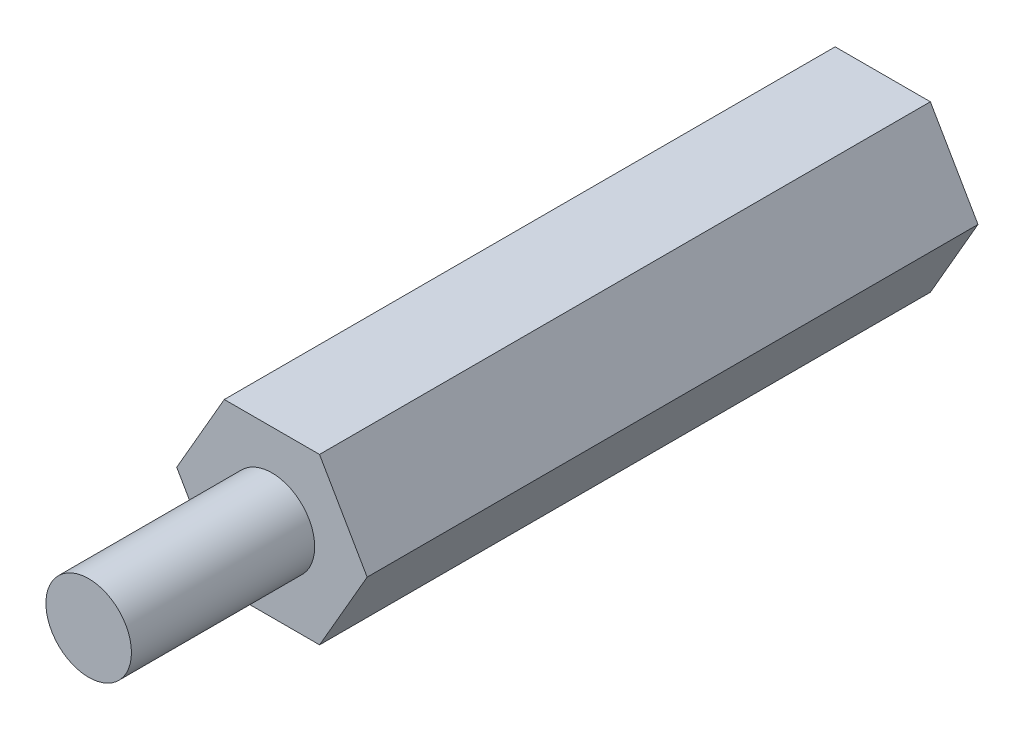
ISO-10303-21;
HEADER;
FILE_DESCRIPTION(('STEP AP214'),'2;1');
FILE_NAME('part.step','',(''),(''),'','','');
FILE_SCHEMA(('AUTOMOTIVE_DESIGN { 1 0 10303 214 1 1 1 1 }'));
ENDSEC;
DATA;
#1=APPLICATION_CONTEXT('core data for automotive mechanical design processes');
#2=APPLICATION_PROTOCOL_DEFINITION('international standard','automotive_design',2000,#1);
#3=PRODUCT_CONTEXT('',#1,'mechanical');
#4=PRODUCT('Part','Part','',(#3));
#5=PRODUCT_RELATED_PRODUCT_CATEGORY('part','',(#4));
#6=PRODUCT_DEFINITION_FORMATION('','',#4);
#7=PRODUCT_DEFINITION_CONTEXT('part definition',#1,'design');
#8=PRODUCT_DEFINITION('design','',#6,#7);
#9=PRODUCT_DEFINITION_SHAPE('','',#8);
#10=(LENGTH_UNIT() NAMED_UNIT(*) SI_UNIT(.MILLI.,.METRE.));
#11=(NAMED_UNIT(*) PLANE_ANGLE_UNIT() SI_UNIT($,.RADIAN.));
#12=(NAMED_UNIT(*) SI_UNIT($,.STERADIAN.) SOLID_ANGLE_UNIT());
#13=UNCERTAINTY_MEASURE_WITH_UNIT(LENGTH_MEASURE(1.E-05),#10,'distance_accuracy_value','');
#14=(GEOMETRIC_REPRESENTATION_CONTEXT(3) GLOBAL_UNCERTAINTY_ASSIGNED_CONTEXT((#13)) GLOBAL_UNIT_ASSIGNED_CONTEXT((#10,
#11,#12)) REPRESENTATION_CONTEXT('',''));
#15=CARTESIAN_POINT('',(0.,0.,0.));
#16=DIRECTION('',(0.,0.,1.));
#17=DIRECTION('',(1.,0.,0.));
#18=AXIS2_PLACEMENT_3D('',#15,#16,#17);
#19=CARTESIAN_POINT('',(0.,0.,26.));
#20=DIRECTION('',(0.,0.,-1.));
#21=DIRECTION('',(-1.,0.,0.));
#22=AXIS2_PLACEMENT_3D('',#19,#20,#21);
#23=CYLINDRICAL_SURFACE('',#22,1.4);
#24=CARTESIAN_POINT('',(0.,0.,26.));
#25=DIRECTION('',(0.,0.,1.));
#26=DIRECTION('',(1.,0.,0.));
#27=AXIS2_PLACEMENT_3D('',#24,#25,#26);
#28=CIRCLE('',#27,1.4);
#29=CARTESIAN_POINT('',(1.4,0.,26.));
#30=VERTEX_POINT('',#29);
#31=EDGE_CURVE('E11',#30,#30,#28,.T.);
#32=ORIENTED_EDGE('',*,*,#31,.F.);
#33=EDGE_LOOP('',(#32));
#34=FACE_BOUND('',#33,.T.);
#35=CARTESIAN_POINT('',(0.,0.,20.));
#36=DIRECTION('',(0.,0.,1.));
#37=DIRECTION('',(1.,0.,0.));
#38=AXIS2_PLACEMENT_3D('',#35,#36,#37);
#39=CIRCLE('',#38,1.4);
#40=CARTESIAN_POINT('',(1.4,0.,20.));
#41=VERTEX_POINT('',#40);
#42=EDGE_CURVE('E45',#41,#41,#39,.T.);
#43=ORIENTED_EDGE('',*,*,#42,.T.);
#44=EDGE_LOOP('',(#43));
#45=FACE_BOUND('',#44,.T.);
#46=ADVANCED_FACE('F42',(#34,#45),#23,.T.);
#47=CARTESIAN_POINT('',(0.,0.,26.));
#48=DIRECTION('',(0.,0.,1.));
#49=DIRECTION('',(1.,0.,0.));
#50=AXIS2_PLACEMENT_3D('',#47,#48,#49);
#51=PLANE('',#50);
#52=ORIENTED_EDGE('',*,*,#31,.T.);
#53=EDGE_LOOP('',(#52));
#54=FACE_BOUND('',#53,.T.);
#55=ADVANCED_FACE('F57',(#54),#51,.T.);
#56=CARTESIAN_POINT('',(0.,0.,20.));
#57=DIRECTION('',(0.,0.,1.));
#58=DIRECTION('',(1.,0.,0.));
#59=AXIS2_PLACEMENT_3D('',#56,#57,#58);
#60=PLANE('',#59);
#61=ORIENTED_EDGE('',*,*,#42,.F.);
#62=EDGE_LOOP('',(#61));
#63=FACE_BOUND('',#62,.T.);
#64=ADVANCED_FACE('F55',(#63),#60,.F.);
#65=CLOSED_SHELL('',(#46,#55,#64));
#66=MANIFOLD_SOLID_BREP('B2',#65);
#67=CARTESIAN_POINT('',(0.,0.,20.));
#68=DIRECTION('',(0.,0.,1.));
#69=DIRECTION('',(1.,0.,0.));
#70=AXIS2_PLACEMENT_3D('',#67,#68,#69);
#71=PLANE('',#70);
#72=DIRECTION('',(-0.999999948616769,-0.000320572081417739,0.));
#73=VECTOR('',#72,1.);
#74=CARTESIAN_POINT('',(1.55798010209363,2.70049958368453,20.));
#75=LINE('',#74,#73);
#76=CARTESIAN_POINT('',(1.55798010209363,2.70049958368453,20.));
#77=VERTEX_POINT('',#76);
#78=CARTESIAN_POINT('',(-1.55971119133329,2.69950013884602,20.));
#79=VERTEX_POINT('',#78);
#80=EDGE_CURVE('E178',#77,#79,#75,.T.);
#81=ORIENTED_EDGE('',*,*,#80,.T.);
#82=DIRECTION('',(-0.499722350742132,-0.866185645325964,0.));
#83=VECTOR('',#82,1.);
#84=CARTESIAN_POINT('',(-1.55971119133329,2.69950013884602,20.));
#85=LINE('',#84,#83);
#86=CARTESIAN_POINT('',(-3.11769129342692,-0.000999444838507815,20.));
#87=VERTEX_POINT('',#86);
#88=EDGE_CURVE('E136',#79,#87,#85,.T.);
#89=ORIENTED_EDGE('',*,*,#88,.T.);
#90=DIRECTION('',(0.500277597874637,-0.865865073244546,0.));
#91=VECTOR('',#90,1.);
#92=CARTESIAN_POINT('',(-3.11769129342692,-0.000999444838507815,20.));
#93=LINE('',#92,#91);
#94=CARTESIAN_POINT('',(-1.55798010209363,-2.70049958368453,20.));
#95=VERTEX_POINT('',#94);
#96=EDGE_CURVE('E149',#87,#95,#93,.T.);
#97=ORIENTED_EDGE('',*,*,#96,.T.);
#98=DIRECTION('',(0.999999948616769,0.000320572081418156,0.));
#99=VECTOR('',#98,1.);
#100=CARTESIAN_POINT('',(-1.55798010209363,-2.70049958368453,20.));
#101=LINE('',#100,#99);
#102=CARTESIAN_POINT('',(1.55971119133329,-2.69950013884602,20.));
#103=VERTEX_POINT('',#102);
#104=EDGE_CURVE('E143',#95,#103,#101,.T.);
#105=ORIENTED_EDGE('',*,*,#104,.T.);
#106=DIRECTION('',(0.499722350742132,0.866185645325964,0.));
#107=VECTOR('',#106,1.);
#108=CARTESIAN_POINT('',(1.55971119133329,-2.69950013884602,20.));
#109=LINE('',#108,#107);
#110=CARTESIAN_POINT('',(3.11769129342692,0.000999444838507037,20.));
#111=VERTEX_POINT('',#110);
#112=EDGE_CURVE('E147',#103,#111,#109,.T.);
#113=ORIENTED_EDGE('',*,*,#112,.T.);
#114=DIRECTION('',(-0.500277597874636,0.865865073244546,0.));
#115=VECTOR('',#114,1.);
#116=CARTESIAN_POINT('',(3.11769129342692,0.000999444838507037,20.));
#117=LINE('',#116,#115);
#118=EDGE_CURVE('E99',#111,#77,#117,.T.);
#119=ORIENTED_EDGE('',*,*,#118,.T.);
#120=EDGE_LOOP('',(#81,#89,#97,#105,#113,#119));
#121=FACE_BOUND('',#120,.T.);
#122=CARTESIAN_POINT('',(0.,0.,20.));
#123=DIRECTION('',(0.,0.,1.));
#124=DIRECTION('',(1.,0.,0.));
#125=AXIS2_PLACEMENT_3D('',#122,#123,#124);
#126=CIRCLE('',#125,1.4);
#127=CARTESIAN_POINT('',(1.4,0.,20.));
#128=VERTEX_POINT('',#127);
#129=EDGE_CURVE('E171',#128,#128,#126,.T.);
#130=ORIENTED_EDGE('',*,*,#129,.F.);
#131=EDGE_LOOP('',(#130));
#132=FACE_BOUND('',#131,.T.);
#133=ADVANCED_FACE('F82',(#121,#132),#71,.T.);
#134=CARTESIAN_POINT('',(0.,0.,0.));
#135=DIRECTION('',(0.,0.,1.));
#136=DIRECTION('',(1.,0.,0.));
#137=AXIS2_PLACEMENT_3D('',#134,#135,#136);
#138=PLANE('',#137);
#139=DIRECTION('',(-0.999999948616769,-0.000320572081417739,0.));
#140=VECTOR('',#139,1.);
#141=CARTESIAN_POINT('',(1.55798010209363,2.70049958368453,0.));
#142=LINE('',#141,#140);
#143=CARTESIAN_POINT('',(1.55798010209363,2.70049958368453,0.));
#144=VERTEX_POINT('',#143);
#145=CARTESIAN_POINT('',(-1.55971119133329,2.69950013884602,0.));
#146=VERTEX_POINT('',#145);
#147=EDGE_CURVE('E167',#144,#146,#142,.T.);
#148=ORIENTED_EDGE('',*,*,#147,.F.);
#149=DIRECTION('',(-0.500277597874636,0.865865073244546,0.));
#150=VECTOR('',#149,1.);
#151=CARTESIAN_POINT('',(3.11769129342692,0.000999444838507037,0.));
#152=LINE('',#151,#150);
#153=CARTESIAN_POINT('',(3.11769129342692,0.000999444838507037,0.));
#154=VERTEX_POINT('',#153);
#155=EDGE_CURVE('E128',#154,#144,#152,.T.);
#156=ORIENTED_EDGE('',*,*,#155,.F.);
#157=DIRECTION('',(0.499722350742132,0.866185645325964,0.));
#158=VECTOR('',#157,1.);
#159=CARTESIAN_POINT('',(1.55971119133329,-2.69950013884602,0.));
#160=LINE('',#159,#158);
#161=CARTESIAN_POINT('',(1.55971119133329,-2.69950013884602,0.));
#162=VERTEX_POINT('',#161);
#163=EDGE_CURVE('E122',#162,#154,#160,.T.);
#164=ORIENTED_EDGE('',*,*,#163,.F.);
#165=DIRECTION('',(0.999999948616769,0.000320572081418156,0.));
#166=VECTOR('',#165,1.);
#167=CARTESIAN_POINT('',(-1.55798010209363,-2.70049958368453,0.));
#168=LINE('',#167,#166);
#169=CARTESIAN_POINT('',(-1.55798010209363,-2.70049958368453,0.));
#170=VERTEX_POINT('',#169);
#171=EDGE_CURVE('E157',#170,#162,#168,.T.);
#172=ORIENTED_EDGE('',*,*,#171,.F.);
#173=DIRECTION('',(0.500277597874637,-0.865865073244546,0.));
#174=VECTOR('',#173,1.);
#175=CARTESIAN_POINT('',(-3.11769129342692,-0.000999444838507815,0.));
#176=LINE('',#175,#174);
#177=CARTESIAN_POINT('',(-3.11769129342692,-0.000999444838507815,0.));
#178=VERTEX_POINT('',#177);
#179=EDGE_CURVE('E173',#178,#170,#176,.T.);
#180=ORIENTED_EDGE('',*,*,#179,.F.);
#181=DIRECTION('',(-0.499722350742132,-0.866185645325964,0.));
#182=VECTOR('',#181,1.);
#183=CARTESIAN_POINT('',(-1.55971119133329,2.69950013884602,0.));
#184=LINE('',#183,#182);
#185=EDGE_CURVE('E170',#146,#178,#184,.T.);
#186=ORIENTED_EDGE('',*,*,#185,.F.);
#187=EDGE_LOOP('',(#148,#156,#164,#172,#180,#186));
#188=FACE_BOUND('',#187,.T.);
#189=CARTESIAN_POINT('',(0.,0.,0.));
#190=DIRECTION('',(0.,0.,1.));
#191=DIRECTION('',(1.,0.,0.));
#192=AXIS2_PLACEMENT_3D('',#189,#190,#191);
#193=CIRCLE('',#192,1.4);
#194=CARTESIAN_POINT('',(1.4,0.,0.));
#195=VERTEX_POINT('',#194);
#196=EDGE_CURVE('E271',#195,#195,#193,.T.);
#197=ORIENTED_EDGE('',*,*,#196,.T.);
#198=EDGE_LOOP('',(#197));
#199=FACE_BOUND('',#198,.T.);
#200=ADVANCED_FACE('F187',(#188,#199),#138,.F.);
#201=CARTESIAN_POINT('',(1.55798010209363,2.70049958368453,20.));
#202=DIRECTION('',(0.000320572081417739,-0.999999948616769,0.));
#203=DIRECTION('',(0.999999948616769,0.000320572081417739,0.));
#204=AXIS2_PLACEMENT_3D('',#201,#202,#203);
#205=PLANE('',#204);
#206=ORIENTED_EDGE('',*,*,#147,.T.);
#207=DIRECTION('',(0.,0.,-1.));
#208=VECTOR('',#207,1.);
#209=CARTESIAN_POINT('',(-1.55971119133329,2.69950013884602,20.));
#210=LINE('',#209,#208);
#211=EDGE_CURVE('E40',#79,#146,#210,.T.);
#212=ORIENTED_EDGE('',*,*,#211,.F.);
#213=ORIENTED_EDGE('',*,*,#80,.F.);
#214=DIRECTION('',(0.,0.,-1.));
#215=VECTOR('',#214,1.);
#216=CARTESIAN_POINT('',(1.55798010209363,2.70049958368453,20.));
#217=LINE('',#216,#215);
#218=EDGE_CURVE('E163',#77,#144,#217,.T.);
#219=ORIENTED_EDGE('',*,*,#218,.T.);
#220=EDGE_LOOP('',(#206,#212,#213,#219));
#221=FACE_BOUND('',#220,.T.);
#222=ADVANCED_FACE('F84',(#221),#205,.F.);
#223=CARTESIAN_POINT('',(-1.55971119133329,2.69950013884602,20.));
#224=DIRECTION('',(0.866185645325964,-0.499722350742132,0.));
#225=DIRECTION('',(0.499722350742132,0.866185645325964,0.));
#226=AXIS2_PLACEMENT_3D('',#223,#224,#225);
#227=PLANE('',#226);
#228=ORIENTED_EDGE('',*,*,#185,.T.);
#229=DIRECTION('',(0.,0.,-1.));
#230=VECTOR('',#229,1.);
#231=CARTESIAN_POINT('',(-3.11769129342692,-0.000999444838507815,20.));
#232=LINE('',#231,#230);
#233=EDGE_CURVE('E91',#87,#178,#232,.T.);
#234=ORIENTED_EDGE('',*,*,#233,.F.);
#235=ORIENTED_EDGE('',*,*,#88,.F.);
#236=ORIENTED_EDGE('',*,*,#211,.T.);
#237=EDGE_LOOP('',(#228,#234,#235,#236));
#238=FACE_BOUND('',#237,.T.);
#239=ADVANCED_FACE('F212',(#238),#227,.F.);
#240=CARTESIAN_POINT('',(-3.11769129342692,-0.000999444838507815,20.));
#241=DIRECTION('',(0.865865073244546,0.500277597874637,0.));
#242=DIRECTION('',(-0.500277597874636,0.865865073244546,0.));
#243=AXIS2_PLACEMENT_3D('',#240,#241,#242);
#244=PLANE('',#243);
#245=ORIENTED_EDGE('',*,*,#179,.T.);
#246=DIRECTION('',(0.,0.,-1.));
#247=VECTOR('',#246,1.);
#248=CARTESIAN_POINT('',(-1.55798010209363,-2.70049958368453,20.));
#249=LINE('',#248,#247);
#250=EDGE_CURVE('E158',#95,#170,#249,.T.);
#251=ORIENTED_EDGE('',*,*,#250,.F.);
#252=ORIENTED_EDGE('',*,*,#96,.F.);
#253=ORIENTED_EDGE('',*,*,#233,.T.);
#254=EDGE_LOOP('',(#245,#251,#252,#253));
#255=FACE_BOUND('',#254,.T.);
#256=ADVANCED_FACE('F184',(#255),#244,.F.);
#257=CARTESIAN_POINT('',(-1.55798010209363,-2.70049958368453,20.));
#258=DIRECTION('',(-0.000320572081418156,0.999999948616769,0.));
#259=DIRECTION('',(-0.999999948616769,-0.000320572081418156,0.));
#260=AXIS2_PLACEMENT_3D('',#257,#258,#259);
#261=PLANE('',#260);
#262=ORIENTED_EDGE('',*,*,#171,.T.);
#263=DIRECTION('',(0.,0.,-1.));
#264=VECTOR('',#263,1.);
#265=CARTESIAN_POINT('',(1.55971119133329,-2.69950013884602,20.));
#266=LINE('',#265,#264);
#267=EDGE_CURVE('E154',#103,#162,#266,.T.);
#268=ORIENTED_EDGE('',*,*,#267,.F.);
#269=ORIENTED_EDGE('',*,*,#104,.F.);
#270=ORIENTED_EDGE('',*,*,#250,.T.);
#271=EDGE_LOOP('',(#262,#268,#269,#270));
#272=FACE_BOUND('',#271,.T.);
#273=ADVANCED_FACE('F155',(#272),#261,.F.);
#274=CARTESIAN_POINT('',(1.55971119133329,-2.69950013884602,20.));
#275=DIRECTION('',(-0.866185645325964,0.499722350742132,0.));
#276=DIRECTION('',(-0.499722350742132,-0.866185645325964,0.));
#277=AXIS2_PLACEMENT_3D('',#274,#275,#276);
#278=PLANE('',#277);
#279=ORIENTED_EDGE('',*,*,#163,.T.);
#280=DIRECTION('',(0.,0.,-1.));
#281=VECTOR('',#280,1.);
#282=CARTESIAN_POINT('',(3.11769129342692,0.000999444838507037,20.));
#283=LINE('',#282,#281);
#284=EDGE_CURVE('E159',#111,#154,#283,.T.);
#285=ORIENTED_EDGE('',*,*,#284,.F.);
#286=ORIENTED_EDGE('',*,*,#112,.F.);
#287=ORIENTED_EDGE('',*,*,#267,.T.);
#288=EDGE_LOOP('',(#279,#285,#286,#287));
#289=FACE_BOUND('',#288,.T.);
#290=ADVANCED_FACE('F161',(#289),#278,.F.);
#291=CARTESIAN_POINT('',(3.11769129342692,0.000999444838507037,20.));
#292=DIRECTION('',(-0.865865073244546,-0.500277597874636,0.));
#293=DIRECTION('',(0.500277597874636,-0.865865073244546,0.));
#294=AXIS2_PLACEMENT_3D('',#291,#292,#293);
#295=PLANE('',#294);
#296=ORIENTED_EDGE('',*,*,#155,.T.);
#297=ORIENTED_EDGE('',*,*,#218,.F.);
#298=ORIENTED_EDGE('',*,*,#118,.F.);
#299=ORIENTED_EDGE('',*,*,#284,.T.);
#300=EDGE_LOOP('',(#296,#297,#298,#299));
#301=FACE_BOUND('',#300,.T.);
#302=ADVANCED_FACE('F192',(#301),#295,.F.);
#303=CARTESIAN_POINT('',(0.,0.,20.));
#304=DIRECTION('',(0.,0.,-1.));
#305=DIRECTION('',(-1.,0.,0.));
#306=AXIS2_PLACEMENT_3D('',#303,#304,#305);
#307=CYLINDRICAL_SURFACE('',#306,1.4);
#308=ORIENTED_EDGE('',*,*,#129,.T.);
#309=EDGE_LOOP('',(#308));
#310=FACE_BOUND('',#309,.T.);
#311=ORIENTED_EDGE('',*,*,#196,.F.);
#312=EDGE_LOOP('',(#311));
#313=FACE_BOUND('',#312,.T.);
#314=ADVANCED_FACE('F194',(#310,#313),#307,.F.);
#315=CLOSED_SHELL('',(#133,#200,#222,#239,#256,#273,#290,#302,#314));
#316=MANIFOLD_SOLID_BREP('B6',#315);
#317=ADVANCED_BREP_SHAPE_REPRESENTATION('',(#18,#66,#316),#14);
#318=SHAPE_DEFINITION_REPRESENTATION(#9,#317);
ENDSEC;
END-ISO-10303-21;
